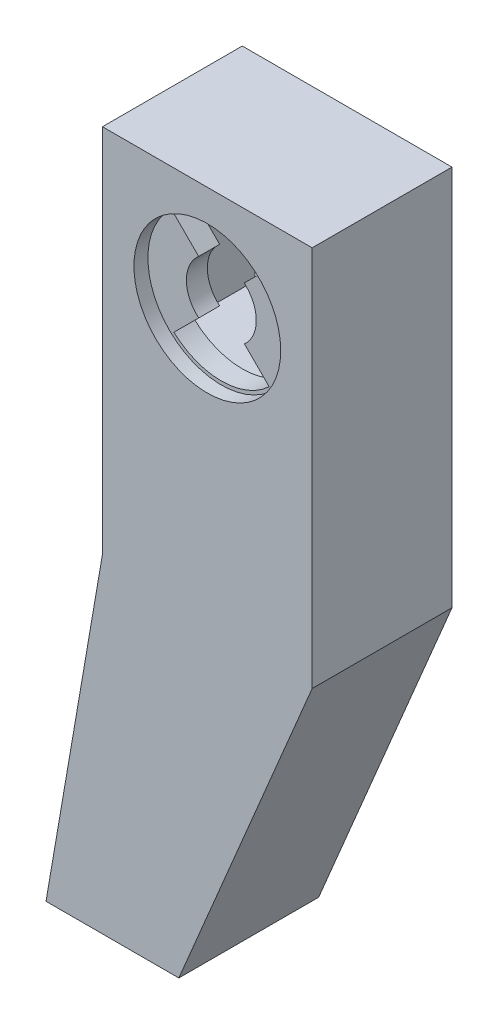
ISO-10303-21;
HEADER;
FILE_DESCRIPTION(('STEP AP214'),'2;1');
FILE_NAME('part.step','',(''),(''),'','','');
FILE_SCHEMA(('AUTOMOTIVE_DESIGN { 1 0 10303 214 1 1 1 1 }'));
ENDSEC;
DATA;
#1=APPLICATION_CONTEXT('core data for automotive mechanical design processes');
#2=APPLICATION_PROTOCOL_DEFINITION('international standard','automotive_design',2000,#1);
#3=PRODUCT_CONTEXT('',#1,'mechanical');
#4=PRODUCT('Part','Part','',(#3));
#5=PRODUCT_RELATED_PRODUCT_CATEGORY('part','',(#4));
#6=PRODUCT_DEFINITION_FORMATION('','',#4);
#7=PRODUCT_DEFINITION_CONTEXT('part definition',#1,'design');
#8=PRODUCT_DEFINITION('design','',#6,#7);
#9=PRODUCT_DEFINITION_SHAPE('','',#8);
#10=(LENGTH_UNIT() NAMED_UNIT(*) SI_UNIT(.MILLI.,.METRE.));
#11=(NAMED_UNIT(*) PLANE_ANGLE_UNIT() SI_UNIT($,.RADIAN.));
#12=(NAMED_UNIT(*) SI_UNIT($,.STERADIAN.) SOLID_ANGLE_UNIT());
#13=UNCERTAINTY_MEASURE_WITH_UNIT(LENGTH_MEASURE(1.E-05),#10,'distance_accuracy_value','');
#14=(GEOMETRIC_REPRESENTATION_CONTEXT(3) GLOBAL_UNCERTAINTY_ASSIGNED_CONTEXT((#13)) GLOBAL_UNIT_ASSIGNED_CONTEXT((#10,
#11,#12)) REPRESENTATION_CONTEXT('',''));
#15=CARTESIAN_POINT('',(0.,0.,0.));
#16=DIRECTION('',(0.,0.,1.));
#17=DIRECTION('',(1.,0.,0.));
#18=AXIS2_PLACEMENT_3D('',#15,#16,#17);
#19=CARTESIAN_POINT('',(-28.6057259152176,11.0797806827455,-5.));
#20=DIRECTION('',(-0.707106781186547,-0.707106781186548,0.));
#21=DIRECTION('',(0.707106781186548,-0.707106781186547,0.));
#22=AXIS2_PLACEMENT_3D('',#19,#20,#21);
#23=PLANE('',#22);
#24=DIRECTION('',(0.,0.,1.));
#25=VECTOR('',#24,1.);
#26=CARTESIAN_POINT('',(-25.066760196614,7.54081496414187,-5.));
#27=LINE('',#26,#25);
#28=CARTESIAN_POINT('',(-25.066760196614,7.54081496414187,-5.));
#29=VERTEX_POINT('',#28);
#30=CARTESIAN_POINT('',(-25.066760196614,7.54081496414187,-2.));
#31=VERTEX_POINT('',#30);
#32=EDGE_CURVE('E253',#29,#31,#27,.T.);
#33=ORIENTED_EDGE('',*,*,#32,.T.);
#34=DIRECTION('',(-0.707106781186548,0.707106781186547,0.));
#35=VECTOR('',#34,1.);
#36=CARTESIAN_POINT('',(-28.6057259152176,11.0797806827455,-2.));
#37=LINE('',#36,#35);
#38=CARTESIAN_POINT('',(-28.6057259152176,11.0797806827455,-2.));
#39=VERTEX_POINT('',#38);
#40=EDGE_CURVE('E243',#31,#39,#37,.T.);
#41=ORIENTED_EDGE('',*,*,#40,.T.);
#42=DIRECTION('',(0.,0.,1.));
#43=VECTOR('',#42,1.);
#44=CARTESIAN_POINT('',(-28.6057259152176,11.0797806827455,-5.));
#45=LINE('',#44,#43);
#46=CARTESIAN_POINT('',(-28.6057259152176,11.0797806827455,-5.));
#47=VERTEX_POINT('',#46);
#48=EDGE_CURVE('E250',#47,#39,#45,.T.);
#49=ORIENTED_EDGE('',*,*,#48,.F.);
#50=DIRECTION('',(0.707106781186548,-0.707106781186547,0.));
#51=VECTOR('',#50,1.);
#52=CARTESIAN_POINT('',(-28.6057259152176,11.0797806827455,-5.));
#53=LINE('',#52,#51);
#54=EDGE_CURVE('E254',#47,#29,#53,.T.);
#55=ORIENTED_EDGE('',*,*,#54,.T.);
#56=EDGE_LOOP('',(#33,#41,#49,#55));
#57=FACE_BOUND('',#56,.T.);
#58=ADVANCED_FACE('F112',(#57),#23,.T.);
#59=CARTESIAN_POINT('',(-31.9142857142857,14.8285714285714,-5.));
#60=DIRECTION('',(0.,0.,1.));
#61=DIRECTION('',(1.,0.,0.));
#62=AXIS2_PLACEMENT_3D('',#59,#60,#61);
#63=CYLINDRICAL_SURFACE('',#62,10.);
#64=CARTESIAN_POINT('',(-31.9142857142857,14.8285714285714,-2.));
#65=DIRECTION('',(0.,0.,1.));
#66=DIRECTION('',(1.,0.,0.));
#67=AXIS2_PLACEMENT_3D('',#64,#65,#66);
#68=CIRCLE('',#67,10.);
#69=CARTESIAN_POINT('',(-38.6930913069154,7.47685089951612,-2.));
#70=VERTEX_POINT('',#69);
#71=EDGE_CURVE('E255',#31,#70,#68,.F.);
#72=ORIENTED_EDGE('',*,*,#71,.F.);
#73=ORIENTED_EDGE('',*,*,#32,.F.);
#74=CARTESIAN_POINT('',(-31.9142857142857,14.8285714285714,-5.));
#75=DIRECTION('',(0.,0.,1.));
#76=DIRECTION('',(1.,0.,0.));
#77=AXIS2_PLACEMENT_3D('',#74,#75,#76);
#78=CIRCLE('',#77,10.);
#79=CARTESIAN_POINT('',(-38.6930913069154,7.47685089951612,-5.));
#80=VERTEX_POINT('',#79);
#81=EDGE_CURVE('E462',#80,#29,#78,.T.);
#82=ORIENTED_EDGE('',*,*,#81,.F.);
#83=DIRECTION('',(0.,0.,1.));
#84=VECTOR('',#83,1.);
#85=CARTESIAN_POINT('',(-38.6930913069154,7.47685089951612,-5.));
#86=LINE('',#85,#84);
#87=EDGE_CURVE('E283',#80,#70,#86,.T.);
#88=ORIENTED_EDGE('',*,*,#87,.T.);
#89=EDGE_LOOP('',(#72,#73,#82,#88));
#90=FACE_BOUND('',#89,.T.);
#91=ADVANCED_FACE('F398',(#90),#63,.F.);
#92=CARTESIAN_POINT('',(-35.1517383071989,11.0182038992326,-5.));
#93=DIRECTION('',(-0.707106781186548,0.707106781186547,0.));
#94=DIRECTION('',(-0.707106781186547,-0.707106781186548,0.));
#95=AXIS2_PLACEMENT_3D('',#92,#93,#94);
#96=PLANE('',#95);
#97=DIRECTION('',(0.707106781186547,0.707106781186548,0.));
#98=VECTOR('',#97,1.);
#99=CARTESIAN_POINT('',(-35.1517383071989,11.0182038992326,-2.));
#100=LINE('',#99,#98);
#101=CARTESIAN_POINT('',(-35.1517383071989,11.0182038992326,-2.));
#102=VERTEX_POINT('',#101);
#103=EDGE_CURVE('E458',#70,#102,#100,.T.);
#104=ORIENTED_EDGE('',*,*,#103,.F.);
#105=ORIENTED_EDGE('',*,*,#87,.F.);
#106=DIRECTION('',(-0.707106781186547,-0.707106781186548,0.));
#107=VECTOR('',#106,1.);
#108=CARTESIAN_POINT('',(-35.1517383071989,11.0182038992326,-5.));
#109=LINE('',#108,#107);
#110=CARTESIAN_POINT('',(-35.1517383071989,11.0182038992326,-5.));
#111=VERTEX_POINT('',#110);
#112=EDGE_CURVE('E465',#111,#80,#109,.T.);
#113=ORIENTED_EDGE('',*,*,#112,.F.);
#114=DIRECTION('',(0.,0.,1.));
#115=VECTOR('',#114,1.);
#116=CARTESIAN_POINT('',(-35.1517383071989,11.0182038992326,-5.));
#117=LINE('',#116,#115);
#118=EDGE_CURVE('E280',#111,#102,#117,.T.);
#119=ORIENTED_EDGE('',*,*,#118,.T.);
#120=EDGE_LOOP('',(#104,#105,#113,#119));
#121=FACE_BOUND('',#120,.T.);
#122=ADVANCED_FACE('F403',(#121),#96,.F.);
#123=CARTESIAN_POINT('',(-31.9142857142857,14.8285714285714,-5.));
#124=DIRECTION('',(0.,0.,1.));
#125=DIRECTION('',(1.,0.,0.));
#126=AXIS2_PLACEMENT_3D('',#123,#124,#125);
#127=CYLINDRICAL_SURFACE('',#126,5.);
#128=CARTESIAN_POINT('',(-31.9142857142857,14.8285714285714,-2.));
#129=DIRECTION('',(0.,0.,1.));
#130=DIRECTION('',(1.,0.,0.));
#131=AXIS2_PLACEMENT_3D('',#128,#129,#130);
#132=CIRCLE('',#131,5.);
#133=CARTESIAN_POINT('',(-35.1517383071989,18.6389389579103,-2.));
#134=VERTEX_POINT('',#133);
#135=EDGE_CURVE('E456',#102,#134,#132,.F.);
#136=ORIENTED_EDGE('',*,*,#135,.F.);
#137=ORIENTED_EDGE('',*,*,#118,.F.);
#138=CARTESIAN_POINT('',(-31.9142857142857,14.8285714285714,-5.));
#139=DIRECTION('',(0.,0.,1.));
#140=DIRECTION('',(1.,0.,0.));
#141=AXIS2_PLACEMENT_3D('',#138,#139,#140);
#142=CIRCLE('',#141,5.);
#143=CARTESIAN_POINT('',(-35.1517383071989,18.6389389579103,-5.));
#144=VERTEX_POINT('',#143);
#145=EDGE_CURVE('E468',#144,#111,#142,.T.);
#146=ORIENTED_EDGE('',*,*,#145,.F.);
#147=DIRECTION('',(0.,0.,1.));
#148=VECTOR('',#147,1.);
#149=CARTESIAN_POINT('',(-35.1517383071989,18.6389389579103,-5.));
#150=LINE('',#149,#148);
#151=EDGE_CURVE('E277',#144,#134,#150,.T.);
#152=ORIENTED_EDGE('',*,*,#151,.T.);
#153=EDGE_LOOP('',(#136,#137,#146,#152));
#154=FACE_BOUND('',#153,.T.);
#155=ADVANCED_FACE('F491',(#154),#127,.F.);
#156=CARTESIAN_POINT('',(-35.1517383071989,18.6389389579103,-5.));
#157=DIRECTION('',(0.707106781186548,0.707106781186547,0.));
#158=DIRECTION('',(-0.707106781186547,0.707106781186548,0.));
#159=AXIS2_PLACEMENT_3D('',#156,#157,#158);
#160=PLANE('',#159);
#161=DIRECTION('',(0.,0.,1.));
#162=VECTOR('',#161,1.);
#163=CARTESIAN_POINT('',(-38.6930913069154,22.1802919576268,-5.));
#164=LINE('',#163,#162);
#165=CARTESIAN_POINT('',(-38.6930913069154,22.1802919576268,-5.));
#166=VERTEX_POINT('',#165);
#167=CARTESIAN_POINT('',(-38.6930913069154,22.1802919576268,-2.));
#168=VERTEX_POINT('',#167);
#169=EDGE_CURVE('E274',#166,#168,#164,.T.);
#170=ORIENTED_EDGE('',*,*,#169,.T.);
#171=DIRECTION('',(0.707106781186547,-0.707106781186548,0.));
#172=VECTOR('',#171,1.);
#173=CARTESIAN_POINT('',(-35.1517383071989,18.6389389579103,-2.));
#174=LINE('',#173,#172);
#175=EDGE_CURVE('E453',#168,#134,#174,.T.);
#176=ORIENTED_EDGE('',*,*,#175,.T.);
#177=ORIENTED_EDGE('',*,*,#151,.F.);
#178=DIRECTION('',(-0.707106781186547,0.707106781186548,0.));
#179=VECTOR('',#178,1.);
#180=CARTESIAN_POINT('',(-35.1517383071989,18.6389389579103,-5.));
#181=LINE('',#180,#179);
#182=EDGE_CURVE('E471',#144,#166,#181,.T.);
#183=ORIENTED_EDGE('',*,*,#182,.T.);
#184=EDGE_LOOP('',(#170,#176,#177,#183));
#185=FACE_BOUND('',#184,.T.);
#186=ADVANCED_FACE('F495',(#185),#160,.T.);
#187=CARTESIAN_POINT('',(-31.9142857142857,14.8285714285714,-5.));
#188=DIRECTION('',(0.,0.,1.));
#189=DIRECTION('',(1.,0.,0.));
#190=AXIS2_PLACEMENT_3D('',#187,#188,#189);
#191=CYLINDRICAL_SURFACE('',#190,10.);
#192=CARTESIAN_POINT('',(-31.9142857142857,14.8285714285714,-2.));
#193=DIRECTION('',(0.,0.,1.));
#194=DIRECTION('',(1.,0.,0.));
#195=AXIS2_PLACEMENT_3D('',#192,#193,#194);
#196=CIRCLE('',#195,10.);
#197=CARTESIAN_POINT('',(-25.0985746011971,22.1460902719308,-2.));
#198=VERTEX_POINT('',#197);
#199=EDGE_CURVE('E451',#168,#198,#196,.F.);
#200=ORIENTED_EDGE('',*,*,#199,.F.);
#201=ORIENTED_EDGE('',*,*,#169,.F.);
#202=CARTESIAN_POINT('',(-31.9142857142857,14.8285714285714,-5.));
#203=DIRECTION('',(0.,0.,1.));
#204=DIRECTION('',(1.,0.,0.));
#205=AXIS2_PLACEMENT_3D('',#202,#203,#204);
#206=CIRCLE('',#205,10.);
#207=CARTESIAN_POINT('',(-25.0985746011971,22.1460902719308,-5.));
#208=VERTEX_POINT('',#207);
#209=EDGE_CURVE('E473',#208,#166,#206,.T.);
#210=ORIENTED_EDGE('',*,*,#209,.F.);
#211=DIRECTION('',(0.,0.,1.));
#212=VECTOR('',#211,1.);
#213=CARTESIAN_POINT('',(-25.0985746011971,22.1460902719308,-5.));
#214=LINE('',#213,#212);
#215=EDGE_CURVE('E271',#208,#198,#214,.T.);
#216=ORIENTED_EDGE('',*,*,#215,.T.);
#217=EDGE_LOOP('',(#200,#201,#210,#216));
#218=FACE_BOUND('',#217,.T.);
#219=ADVANCED_FACE('F499',(#218),#191,.F.);
#220=CARTESIAN_POINT('',(-28.6057259152176,18.6389389579103,-5.));
#221=DIRECTION('',(0.707106781186547,-0.707106781186548,0.));
#222=DIRECTION('',(0.707106781186548,0.707106781186547,0.));
#223=AXIS2_PLACEMENT_3D('',#220,#221,#222);
#224=PLANE('',#223);
#225=DIRECTION('',(-0.707106781186548,-0.707106781186547,0.));
#226=VECTOR('',#225,1.);
#227=CARTESIAN_POINT('',(-28.6057259152176,18.6389389579103,-2.));
#228=LINE('',#227,#226);
#229=CARTESIAN_POINT('',(-28.6057259152176,18.6389389579103,-2.));
#230=VERTEX_POINT('',#229);
#231=EDGE_CURVE('E449',#198,#230,#228,.T.);
#232=ORIENTED_EDGE('',*,*,#231,.F.);
#233=ORIENTED_EDGE('',*,*,#215,.F.);
#234=DIRECTION('',(0.707106781186548,0.707106781186547,0.));
#235=VECTOR('',#234,1.);
#236=CARTESIAN_POINT('',(-28.6057259152176,18.6389389579103,-5.));
#237=LINE('',#236,#235);
#238=CARTESIAN_POINT('',(-28.6057259152176,18.6389389579103,-5.));
#239=VERTEX_POINT('',#238);
#240=EDGE_CURVE('E476',#239,#208,#237,.T.);
#241=ORIENTED_EDGE('',*,*,#240,.F.);
#242=DIRECTION('',(0.,0.,1.));
#243=VECTOR('',#242,1.);
#244=CARTESIAN_POINT('',(-28.6057259152176,18.6389389579103,-5.));
#245=LINE('',#244,#243);
#246=EDGE_CURVE('E263',#239,#230,#245,.T.);
#247=ORIENTED_EDGE('',*,*,#246,.T.);
#248=EDGE_LOOP('',(#232,#233,#241,#247));
#249=FACE_BOUND('',#248,.T.);
#250=ADVANCED_FACE('F502',(#249),#224,.F.);
#251=CARTESIAN_POINT('',(-28.6057259152176,18.6389389579103,-5.));
#252=DIRECTION('',(-0.771047654122615,-0.636777445479982,0.));
#253=DIRECTION('',(0.636777445479982,-0.771047654122615,0.));
#254=AXIS2_PLACEMENT_3D('',#251,#252,#253);
#255=PLANE('',#254);
#256=DIRECTION('',(0.,0.,1.));
#257=VECTOR('',#256,1.);
#258=CARTESIAN_POINT('',(-28.378751808353,18.3641053345042,-5.));
#259=LINE('',#258,#257);
#260=CARTESIAN_POINT('',(-28.378751808353,18.3641053345042,-5.));
#261=VERTEX_POINT('',#260);
#262=CARTESIAN_POINT('',(-28.378751808353,18.3641053345042,-2.));
#263=VERTEX_POINT('',#262);
#264=EDGE_CURVE('E261',#261,#263,#259,.T.);
#265=ORIENTED_EDGE('',*,*,#264,.T.);
#266=DIRECTION('',(-0.636777445479982,0.771047654122615,0.));
#267=VECTOR('',#266,1.);
#268=CARTESIAN_POINT('',(-28.6057259152176,18.6389389579103,-2.));
#269=LINE('',#268,#267);
#270=EDGE_CURVE('E126',#263,#230,#269,.T.);
#271=ORIENTED_EDGE('',*,*,#270,.T.);
#272=ORIENTED_EDGE('',*,*,#246,.F.);
#273=DIRECTION('',(0.636777445479982,-0.771047654122615,0.));
#274=VECTOR('',#273,1.);
#275=CARTESIAN_POINT('',(-28.6057259152176,18.6389389579103,-5.));
#276=LINE('',#275,#274);
#277=EDGE_CURVE('E265',#239,#261,#276,.T.);
#278=ORIENTED_EDGE('',*,*,#277,.T.);
#279=EDGE_LOOP('',(#265,#271,#272,#278));
#280=FACE_BOUND('',#279,.T.);
#281=ADVANCED_FACE('F481',(#280),#255,.T.);
#282=CARTESIAN_POINT('',(-31.9142857142857,14.8285714285714,-5.));
#283=DIRECTION('',(0.,0.,1.));
#284=DIRECTION('',(1.,0.,0.));
#285=AXIS2_PLACEMENT_3D('',#282,#283,#284);
#286=CYLINDRICAL_SURFACE('',#285,5.);
#287=CARTESIAN_POINT('',(-31.9142857142857,14.8285714285714,-2.));
#288=DIRECTION('',(0.,0.,1.));
#289=DIRECTION('',(1.,0.,0.));
#290=AXIS2_PLACEMENT_3D('',#287,#288,#289);
#291=CIRCLE('',#290,5.);
#292=EDGE_CURVE('E12',#263,#39,#291,.F.);
#293=ORIENTED_EDGE('',*,*,#292,.F.);
#294=ORIENTED_EDGE('',*,*,#264,.F.);
#295=CARTESIAN_POINT('',(-31.9142857142857,14.8285714285714,-5.));
#296=DIRECTION('',(0.,0.,1.));
#297=DIRECTION('',(1.,0.,0.));
#298=AXIS2_PLACEMENT_3D('',#295,#296,#297);
#299=CIRCLE('',#298,5.);
#300=EDGE_CURVE('E259',#47,#261,#299,.T.);
#301=ORIENTED_EDGE('',*,*,#300,.F.);
#302=ORIENTED_EDGE('',*,*,#48,.T.);
#303=EDGE_LOOP('',(#293,#294,#301,#302));
#304=FACE_BOUND('',#303,.T.);
#305=ADVANCED_FACE('F257',(#304),#286,.F.);
#306=CARTESIAN_POINT('',(-45.1142857142857,28.0285714285714,-20.));
#307=DIRECTION('',(-1.,0.,0.));
#308=DIRECTION('',(0.,0.,1.));
#309=AXIS2_PLACEMENT_3D('',#306,#307,#308);
#310=PLANE('',#309);
#311=DIRECTION('',(0.,-1.,0.));
#312=VECTOR('',#311,1.);
#313=CARTESIAN_POINT('',(-45.1142857142857,28.0285714285714,-5.));
#314=LINE('',#313,#312);
#315=CARTESIAN_POINT('',(-45.1142857142857,28.0285714285714,-5.));
#316=VERTEX_POINT('',#315);
#317=CARTESIAN_POINT('',(-45.1142857142857,1.62857142857145,-5.));
#318=VERTEX_POINT('',#317);
#319=EDGE_CURVE('E287',#316,#318,#314,.T.);
#320=ORIENTED_EDGE('',*,*,#319,.T.);
#321=DIRECTION('',(0.,0.,1.));
#322=VECTOR('',#321,1.);
#323=CARTESIAN_POINT('',(-45.1142857142857,1.62857142857145,-20.));
#324=LINE('',#323,#322);
#325=CARTESIAN_POINT('',(-45.1142857142857,1.62857142857145,-20.));
#326=VERTEX_POINT('',#325);
#327=EDGE_CURVE('E307',#326,#318,#324,.T.);
#328=ORIENTED_EDGE('',*,*,#327,.F.);
#329=DIRECTION('',(0.,-1.,0.));
#330=VECTOR('',#329,1.);
#331=CARTESIAN_POINT('',(-45.1142857142857,28.0285714285714,-20.));
#332=LINE('',#331,#330);
#333=CARTESIAN_POINT('',(-45.1142857142857,28.0285714285714,-20.));
#334=VERTEX_POINT('',#333);
#335=EDGE_CURVE('E296',#334,#326,#332,.T.);
#336=ORIENTED_EDGE('',*,*,#335,.F.);
#337=DIRECTION('',(0.,0.,1.));
#338=VECTOR('',#337,1.);
#339=CARTESIAN_POINT('',(-45.1142857142857,28.0285714285714,-20.));
#340=LINE('',#339,#338);
#341=EDGE_CURVE('E308',#334,#316,#340,.T.);
#342=ORIENTED_EDGE('',*,*,#341,.T.);
#343=EDGE_LOOP('',(#320,#328,#336,#342));
#344=FACE_BOUND('',#343,.T.);
#345=ADVANCED_FACE('F417',(#344),#310,.F.);
#346=CARTESIAN_POINT('',(-45.1142857142857,28.0285714285714,-20.));
#347=DIRECTION('',(0.,-1.,0.));
#348=DIRECTION('',(0.,0.,-1.));
#349=AXIS2_PLACEMENT_3D('',#346,#347,#348);
#350=PLANE('',#349);
#351=DIRECTION('',(0.,0.,1.));
#352=VECTOR('',#351,1.);
#353=CARTESIAN_POINT('',(-18.7142857142857,28.0285714285714,-20.));
#354=LINE('',#353,#352);
#355=CARTESIAN_POINT('',(-18.7142857142857,28.0285714285714,-20.));
#356=VERTEX_POINT('',#355);
#357=CARTESIAN_POINT('',(-18.7142857142857,28.0285714285714,-5.));
#358=VERTEX_POINT('',#357);
#359=EDGE_CURVE('E311',#356,#358,#354,.T.);
#360=ORIENTED_EDGE('',*,*,#359,.T.);
#361=DIRECTION('',(1.,0.,0.));
#362=VECTOR('',#361,1.);
#363=CARTESIAN_POINT('',(-45.1142857142857,28.0285714285714,-5.));
#364=LINE('',#363,#362);
#365=EDGE_CURVE('E134',#316,#358,#364,.T.);
#366=ORIENTED_EDGE('',*,*,#365,.F.);
#367=ORIENTED_EDGE('',*,*,#341,.F.);
#368=DIRECTION('',(1.,0.,0.));
#369=VECTOR('',#368,1.);
#370=CARTESIAN_POINT('',(-45.1142857142857,28.0285714285714,-20.));
#371=LINE('',#370,#369);
#372=EDGE_CURVE('E305',#334,#356,#371,.T.);
#373=ORIENTED_EDGE('',*,*,#372,.T.);
#374=EDGE_LOOP('',(#360,#366,#367,#373));
#375=FACE_BOUND('',#374,.T.);
#376=ADVANCED_FACE('F413',(#375),#350,.T.);
#377=CARTESIAN_POINT('',(-18.7142857142857,28.0285714285714,-20.));
#378=DIRECTION('',(-1.,0.,0.));
#379=DIRECTION('',(0.,0.,1.));
#380=AXIS2_PLACEMENT_3D('',#377,#378,#379);
#381=PLANE('',#380);
#382=DIRECTION('',(0.,0.,1.));
#383=VECTOR('',#382,1.);
#384=CARTESIAN_POINT('',(-18.7142857142857,1.62857142857145,-20.));
#385=LINE('',#384,#383);
#386=CARTESIAN_POINT('',(-18.7142857142857,1.62857142857145,-20.));
#387=VERTEX_POINT('',#386);
#388=CARTESIAN_POINT('',(-18.7142857142857,1.62857142857145,-5.));
#389=VERTEX_POINT('',#388);
#390=EDGE_CURVE('E313',#387,#389,#385,.T.);
#391=ORIENTED_EDGE('',*,*,#390,.T.);
#392=DIRECTION('',(0.,-1.,0.));
#393=VECTOR('',#392,1.);
#394=CARTESIAN_POINT('',(-18.7142857142857,28.0285714285714,-5.));
#395=LINE('',#394,#393);
#396=EDGE_CURVE('E292',#358,#389,#395,.T.);
#397=ORIENTED_EDGE('',*,*,#396,.F.);
#398=ORIENTED_EDGE('',*,*,#359,.F.);
#399=DIRECTION('',(0.,-1.,0.));
#400=VECTOR('',#399,1.);
#401=CARTESIAN_POINT('',(-18.7142857142857,28.0285714285714,-20.));
#402=LINE('',#401,#400);
#403=EDGE_CURVE('E302',#356,#387,#402,.T.);
#404=ORIENTED_EDGE('',*,*,#403,.T.);
#405=EDGE_LOOP('',(#391,#397,#398,#404));
#406=FACE_BOUND('',#405,.T.);
#407=ADVANCED_FACE('F416',(#406),#381,.T.);
#408=CARTESIAN_POINT('',(-45.1142857142857,1.62857142857145,-20.));
#409=DIRECTION('',(0.,-1.,0.));
#410=DIRECTION('',(0.,0.,-1.));
#411=AXIS2_PLACEMENT_3D('',#408,#409,#410);
#412=PLANE('',#411);
#413=DIRECTION('',(1.,0.,0.));
#414=VECTOR('',#413,1.);
#415=CARTESIAN_POINT('',(-45.1142857142857,1.62857142857145,-5.));
#416=LINE('',#415,#414);
#417=EDGE_CURVE('E290',#318,#389,#416,.T.);
#418=ORIENTED_EDGE('',*,*,#417,.T.);
#419=ORIENTED_EDGE('',*,*,#390,.F.);
#420=DIRECTION('',(1.,0.,0.));
#421=VECTOR('',#420,1.);
#422=CARTESIAN_POINT('',(-45.1142857142857,1.62857142857145,-20.));
#423=LINE('',#422,#421);
#424=EDGE_CURVE('E299',#326,#387,#423,.T.);
#425=ORIENTED_EDGE('',*,*,#424,.F.);
#426=ORIENTED_EDGE('',*,*,#327,.T.);
#427=EDGE_LOOP('',(#418,#419,#425,#426));
#428=FACE_BOUND('',#427,.T.);
#429=ADVANCED_FACE('F395',(#428),#412,.F.);
#430=CARTESIAN_POINT('',(-16.9142857142857,29.8285714285714,-20.));
#431=DIRECTION('',(0.,1.,0.));
#432=DIRECTION('',(-1.,0.,0.));
#433=AXIS2_PLACEMENT_3D('',#430,#431,#432);
#434=PLANE('',#433);
#435=DIRECTION('',(-1.,0.,0.));
#436=VECTOR('',#435,1.);
#437=CARTESIAN_POINT('',(-16.9142857142857,29.8285714285714,0.));
#438=LINE('',#437,#436);
#439=CARTESIAN_POINT('',(-16.9142857142857,29.8285714285714,0.));
#440=VERTEX_POINT('',#439);
#441=CARTESIAN_POINT('',(-46.9142857142857,29.8285714285714,0.));
#442=VERTEX_POINT('',#441);
#443=EDGE_CURVE('E320',#440,#442,#438,.T.);
#444=ORIENTED_EDGE('',*,*,#443,.F.);
#445=DIRECTION('',(0.,0.,1.));
#446=VECTOR('',#445,1.);
#447=CARTESIAN_POINT('',(-16.9142857142857,29.8285714285714,-20.));
#448=LINE('',#447,#446);
#449=CARTESIAN_POINT('',(-16.9142857142857,29.8285714285714,-20.));
#450=VERTEX_POINT('',#449);
#451=EDGE_CURVE('E349',#450,#440,#448,.T.);
#452=ORIENTED_EDGE('',*,*,#451,.F.);
#453=DIRECTION('',(-1.,0.,0.));
#454=VECTOR('',#453,1.);
#455=CARTESIAN_POINT('',(-16.9142857142857,29.8285714285714,-20.));
#456=LINE('',#455,#454);
#457=CARTESIAN_POINT('',(-46.9142857142857,29.8285714285714,-20.));
#458=VERTEX_POINT('',#457);
#459=EDGE_CURVE('E329',#450,#458,#456,.T.);
#460=ORIENTED_EDGE('',*,*,#459,.T.);
#461=DIRECTION('',(0.,0.,1.));
#462=VECTOR('',#461,1.);
#463=CARTESIAN_POINT('',(-46.9142857142857,29.8285714285714,-20.));
#464=LINE('',#463,#462);
#465=EDGE_CURVE('E120',#458,#442,#464,.T.);
#466=ORIENTED_EDGE('',*,*,#465,.T.);
#467=EDGE_LOOP('',(#444,#452,#460,#466));
#468=FACE_BOUND('',#467,.T.);
#469=ADVANCED_FACE('F374',(#468),#434,.T.);
#470=CARTESIAN_POINT('',(-16.9142857142857,-1.88754150191936,-20.));
#471=DIRECTION('',(1.,0.,0.));
#472=DIRECTION('',(0.,1.,0.));
#473=AXIS2_PLACEMENT_3D('',#470,#471,#472);
#474=PLANE('',#473);
#475=DIRECTION('',(0.,1.,0.));
#476=VECTOR('',#475,1.);
#477=CARTESIAN_POINT('',(-16.9142857142857,-1.88754150191936,0.));
#478=LINE('',#477,#476);
#479=CARTESIAN_POINT('',(-16.9142857142857,-24.7700697279648,0.));
#480=VERTEX_POINT('',#479);
#481=EDGE_CURVE('E342',#480,#440,#478,.T.);
#482=ORIENTED_EDGE('',*,*,#481,.F.);
#483=DIRECTION('',(0.,0.,1.));
#484=VECTOR('',#483,1.);
#485=CARTESIAN_POINT('',(-16.9142857142857,-24.7700697279648,-20.));
#486=LINE('',#485,#484);
#487=CARTESIAN_POINT('',(-16.9142857142857,-24.7700697279648,-20.));
#488=VERTEX_POINT('',#487);
#489=EDGE_CURVE('E351',#488,#480,#486,.T.);
#490=ORIENTED_EDGE('',*,*,#489,.F.);
#491=DIRECTION('',(0.,-1.,0.));
#492=VECTOR('',#491,1.);
#493=CARTESIAN_POINT('',(-16.9142857142857,-1.88754150191936,-20.));
#494=LINE('',#493,#492);
#495=EDGE_CURVE('E327',#450,#488,#494,.T.);
#496=ORIENTED_EDGE('',*,*,#495,.F.);
#497=ORIENTED_EDGE('',*,*,#451,.T.);
#498=EDGE_LOOP('',(#482,#490,#496,#497));
#499=FACE_BOUND('',#498,.T.);
#500=ADVANCED_FACE('F387',(#499),#474,.T.);
#501=CARTESIAN_POINT('',(-16.9142857142857,-24.7700697279648,-20.));
#502=DIRECTION('',(-0.921924389996436,0.387369873802416,0.));
#503=DIRECTION('',(-0.387369873802416,-0.921924389996436,0.));
#504=AXIS2_PLACEMENT_3D('',#501,#502,#503);
#505=PLANE('',#504);
#506=DIRECTION('',(-0.387369873802416,-0.921924389996436,0.));
#507=VECTOR('',#506,1.);
#508=CARTESIAN_POINT('',(-16.9142857142857,-24.7700697279648,0.));
#509=LINE('',#508,#507);
#510=CARTESIAN_POINT('',(-35.9908161071076,-70.1714285714286,0.));
#511=VERTEX_POINT('',#510);
#512=EDGE_CURVE('E340',#480,#511,#509,.T.);
#513=ORIENTED_EDGE('',*,*,#512,.T.);
#514=DIRECTION('',(0.,0.,1.));
#515=VECTOR('',#514,1.);
#516=CARTESIAN_POINT('',(-35.9908161071076,-70.1714285714286,-20.));
#517=LINE('',#516,#515);
#518=CARTESIAN_POINT('',(-35.9908161071076,-70.1714285714286,-20.));
#519=VERTEX_POINT('',#518);
#520=EDGE_CURVE('E354',#519,#511,#517,.T.);
#521=ORIENTED_EDGE('',*,*,#520,.F.);
#522=DIRECTION('',(-0.387369873802416,-0.921924389996436,0.));
#523=VECTOR('',#522,1.);
#524=CARTESIAN_POINT('',(-16.9142857142857,-24.7700697279648,-20.));
#525=LINE('',#524,#523);
#526=EDGE_CURVE('E325',#488,#519,#525,.T.);
#527=ORIENTED_EDGE('',*,*,#526,.F.);
#528=ORIENTED_EDGE('',*,*,#489,.T.);
#529=EDGE_LOOP('',(#513,#521,#527,#528));
#530=FACE_BOUND('',#529,.T.);
#531=ADVANCED_FACE('F384',(#530),#505,.F.);
#532=CARTESIAN_POINT('',(-35.9908161071076,-70.1714285714286,-20.));
#533=DIRECTION('',(0.,1.,0.));
#534=DIRECTION('',(0.,0.,1.));
#535=AXIS2_PLACEMENT_3D('',#532,#533,#534);
#536=PLANE('',#535);
#537=CARTESIAN_POINT('',(-40.9908161071076,-70.1714285714286,-12.));
#538=DIRECTION('',(0.,-1.,0.));
#539=DIRECTION('',(0.,0.,-1.));
#540=AXIS2_PLACEMENT_3D('',#537,#538,#539);
#541=CIRCLE('',#540,1.4);
#542=CARTESIAN_POINT('',(-40.9908161071076,-70.1714285714286,-13.4));
#543=VERTEX_POINT('',#542);
#544=EDGE_CURVE('E444',#543,#543,#541,.T.);
#545=ORIENTED_EDGE('',*,*,#544,.F.);
#546=EDGE_LOOP('',(#545));
#547=FACE_BOUND('',#546,.T.);
#548=CARTESIAN_POINT('',(-49.9908161071076,-70.1714285714286,-12.));
#549=DIRECTION('',(0.,-1.,0.));
#550=DIRECTION('',(0.,0.,-1.));
#551=AXIS2_PLACEMENT_3D('',#548,#549,#550);
#552=CIRCLE('',#551,1.4);
#553=CARTESIAN_POINT('',(-49.9908161071076,-70.1714285714286,-13.4));
#554=VERTEX_POINT('',#553);
#555=EDGE_CURVE('E773',#554,#554,#552,.T.);
#556=ORIENTED_EDGE('',*,*,#555,.F.);
#557=EDGE_LOOP('',(#556));
#558=FACE_BOUND('',#557,.T.);
#559=DIRECTION('',(-1.,0.,0.));
#560=VECTOR('',#559,1.);
#561=CARTESIAN_POINT('',(-35.9908161071076,-70.1714285714286,0.));
#562=LINE('',#561,#560);
#563=CARTESIAN_POINT('',(-54.9908161071076,-70.1714285714286,0.));
#564=VERTEX_POINT('',#563);
#565=EDGE_CURVE('E338',#511,#564,#562,.T.);
#566=ORIENTED_EDGE('',*,*,#565,.T.);
#567=DIRECTION('',(0.,0.,1.));
#568=VECTOR('',#567,1.);
#569=CARTESIAN_POINT('',(-54.9908161071076,-70.1714285714286,-20.));
#570=LINE('',#569,#568);
#571=CARTESIAN_POINT('',(-54.9908161071076,-70.1714285714286,-20.));
#572=VERTEX_POINT('',#571);
#573=EDGE_CURVE('E357',#572,#564,#570,.T.);
#574=ORIENTED_EDGE('',*,*,#573,.F.);
#575=DIRECTION('',(-1.,0.,0.));
#576=VECTOR('',#575,1.);
#577=CARTESIAN_POINT('',(-35.9908161071076,-70.1714285714286,-20.));
#578=LINE('',#577,#576);
#579=EDGE_CURVE('E323',#519,#572,#578,.T.);
#580=ORIENTED_EDGE('',*,*,#579,.F.);
#581=ORIENTED_EDGE('',*,*,#520,.T.);
#582=EDGE_LOOP('',(#566,#574,#580,#581));
#583=FACE_BOUND('',#582,.T.);
#584=ADVANCED_FACE('F382',(#547,#558,#583),#536,.F.);
#585=CARTESIAN_POINT('',(-54.9908161071076,-70.1714285714286,-20.));
#586=DIRECTION('',(0.985578249014438,-0.169220315180045,0.));
#587=DIRECTION('',(0.169220315180045,0.985578249014438,0.));
#588=AXIS2_PLACEMENT_3D('',#585,#586,#587);
#589=PLANE('',#588);
#590=DIRECTION('',(0.169220315180045,0.985578249014438,0.));
#591=VECTOR('',#590,1.);
#592=CARTESIAN_POINT('',(-54.9908161071076,-70.1714285714286,0.));
#593=LINE('',#592,#591);
#594=CARTESIAN_POINT('',(-46.9142857142857,-23.1318478083269,0.));
#595=VERTEX_POINT('',#594);
#596=EDGE_CURVE('E335',#564,#595,#593,.T.);
#597=ORIENTED_EDGE('',*,*,#596,.T.);
#598=DIRECTION('',(0.,0.,1.));
#599=VECTOR('',#598,1.);
#600=CARTESIAN_POINT('',(-46.9142857142857,-23.1318478083269,-20.));
#601=LINE('',#600,#599);
#602=CARTESIAN_POINT('',(-46.9142857142857,-23.1318478083269,-20.));
#603=VERTEX_POINT('',#602);
#604=EDGE_CURVE('E332',#603,#595,#601,.T.);
#605=ORIENTED_EDGE('',*,*,#604,.F.);
#606=DIRECTION('',(0.169220315180045,0.985578249014438,0.));
#607=VECTOR('',#606,1.);
#608=CARTESIAN_POINT('',(-54.9908161071076,-70.1714285714286,-20.));
#609=LINE('',#608,#607);
#610=EDGE_CURVE('E319',#572,#603,#609,.T.);
#611=ORIENTED_EDGE('',*,*,#610,.F.);
#612=ORIENTED_EDGE('',*,*,#573,.T.);
#613=EDGE_LOOP('',(#597,#605,#611,#612));
#614=FACE_BOUND('',#613,.T.);
#615=ADVANCED_FACE('F365',(#614),#589,.F.);
#616=CARTESIAN_POINT('',(-46.9142857142857,-1.88754150191938,-20.));
#617=DIRECTION('',(-1.,0.,0.));
#618=DIRECTION('',(0.,-1.,0.));
#619=AXIS2_PLACEMENT_3D('',#616,#617,#618);
#620=PLANE('',#619);
#621=DIRECTION('',(0.,-1.,0.));
#622=VECTOR('',#621,1.);
#623=CARTESIAN_POINT('',(-46.9142857142857,-1.88754150191938,0.));
#624=LINE('',#623,#622);
#625=EDGE_CURVE('E310',#442,#595,#624,.T.);
#626=ORIENTED_EDGE('',*,*,#625,.F.);
#627=ORIENTED_EDGE('',*,*,#465,.F.);
#628=DIRECTION('',(0.,-1.,0.));
#629=VECTOR('',#628,1.);
#630=CARTESIAN_POINT('',(-46.9142857142857,29.8285714285714,-20.));
#631=LINE('',#630,#629);
#632=EDGE_CURVE('E317',#458,#603,#631,.T.);
#633=ORIENTED_EDGE('',*,*,#632,.T.);
#634=ORIENTED_EDGE('',*,*,#604,.T.);
#635=EDGE_LOOP('',(#626,#627,#633,#634));
#636=FACE_BOUND('',#635,.T.);
#637=ADVANCED_FACE('F114',(#636),#620,.T.);
#638=CARTESIAN_POINT('',(0.,0.,-20.));
#639=DIRECTION('',(0.,0.,-1.));
#640=DIRECTION('',(-1.,0.,0.));
#641=AXIS2_PLACEMENT_3D('',#638,#639,#640);
#642=PLANE('',#641);
#643=ORIENTED_EDGE('',*,*,#335,.T.);
#644=ORIENTED_EDGE('',*,*,#424,.T.);
#645=ORIENTED_EDGE('',*,*,#403,.F.);
#646=ORIENTED_EDGE('',*,*,#372,.F.);
#647=EDGE_LOOP('',(#643,#644,#645,#646));
#648=FACE_BOUND('',#647,.T.);
#649=ORIENTED_EDGE('',*,*,#632,.F.);
#650=ORIENTED_EDGE('',*,*,#459,.F.);
#651=ORIENTED_EDGE('',*,*,#495,.T.);
#652=ORIENTED_EDGE('',*,*,#526,.T.);
#653=ORIENTED_EDGE('',*,*,#579,.T.);
#654=ORIENTED_EDGE('',*,*,#610,.T.);
#655=EDGE_LOOP('',(#649,#650,#651,#652,#653,#654));
#656=FACE_BOUND('',#655,.T.);
#657=ADVANCED_FACE('F377',(#648,#656),#642,.T.);
#658=CARTESIAN_POINT('',(0.,0.,0.));
#659=DIRECTION('',(0.,0.,-1.));
#660=DIRECTION('',(-1.,0.,0.));
#661=AXIS2_PLACEMENT_3D('',#658,#659,#660);
#662=PLANE('',#661);
#663=CARTESIAN_POINT('',(-31.9142857142857,14.8285714285714,0.));
#664=DIRECTION('',(0.,0.,1.));
#665=DIRECTION('',(1.,0.,0.));
#666=AXIS2_PLACEMENT_3D('',#663,#664,#665);
#667=CIRCLE('',#666,10.5);
#668=CARTESIAN_POINT('',(-21.4142857142857,14.8285714285714,0.));
#669=VERTEX_POINT('',#668);
#670=EDGE_CURVE('E436',#669,#669,#667,.T.);
#671=ORIENTED_EDGE('',*,*,#670,.F.);
#672=EDGE_LOOP('',(#671));
#673=FACE_BOUND('',#672,.T.);
#674=ORIENTED_EDGE('',*,*,#443,.T.);
#675=ORIENTED_EDGE('',*,*,#625,.T.);
#676=ORIENTED_EDGE('',*,*,#596,.F.);
#677=ORIENTED_EDGE('',*,*,#565,.F.);
#678=ORIENTED_EDGE('',*,*,#512,.F.);
#679=ORIENTED_EDGE('',*,*,#481,.T.);
#680=EDGE_LOOP('',(#674,#675,#676,#677,#678,#679));
#681=FACE_BOUND('',#680,.T.);
#682=ADVANCED_FACE('F369',(#673,#681),#662,.F.);
#683=CARTESIAN_POINT('',(0.,0.,-5.));
#684=DIRECTION('',(0.,0.,1.));
#685=DIRECTION('',(1.,0.,0.));
#686=AXIS2_PLACEMENT_3D('',#683,#684,#685);
#687=PLANE('',#686);
#688=ORIENTED_EDGE('',*,*,#319,.F.);
#689=ORIENTED_EDGE('',*,*,#365,.T.);
#690=ORIENTED_EDGE('',*,*,#396,.T.);
#691=ORIENTED_EDGE('',*,*,#417,.F.);
#692=EDGE_LOOP('',(#688,#689,#690,#691));
#693=FACE_BOUND('',#692,.T.);
#694=ORIENTED_EDGE('',*,*,#54,.F.);
#695=ORIENTED_EDGE('',*,*,#300,.T.);
#696=ORIENTED_EDGE('',*,*,#277,.F.);
#697=ORIENTED_EDGE('',*,*,#240,.T.);
#698=ORIENTED_EDGE('',*,*,#209,.T.);
#699=ORIENTED_EDGE('',*,*,#182,.F.);
#700=ORIENTED_EDGE('',*,*,#145,.T.);
#701=ORIENTED_EDGE('',*,*,#112,.T.);
#702=ORIENTED_EDGE('',*,*,#81,.T.);
#703=EDGE_LOOP('',(#694,#695,#696,#697,#698,#699,#700,#701,#702));
#704=FACE_BOUND('',#703,.T.);
#705=ADVANCED_FACE('F408',(#693,#704),#687,.F.);
#706=CARTESIAN_POINT('',(-31.9142857142857,14.8285714285714,-2.));
#707=DIRECTION('',(0.,0.,1.));
#708=DIRECTION('',(1.,0.,0.));
#709=AXIS2_PLACEMENT_3D('',#706,#707,#708);
#710=CYLINDRICAL_SURFACE('',#709,10.5);
#711=CARTESIAN_POINT('',(-31.9142857142857,14.8285714285714,-2.));
#712=DIRECTION('',(0.,0.,1.));
#713=DIRECTION('',(1.,0.,0.));
#714=AXIS2_PLACEMENT_3D('',#711,#712,#713);
#715=CIRCLE('',#714,10.5);
#716=CARTESIAN_POINT('',(-21.4142857142857,14.8285714285714,-2.));
#717=VERTEX_POINT('',#716);
#718=EDGE_CURVE('E438',#717,#717,#715,.T.);
#719=ORIENTED_EDGE('',*,*,#718,.F.);
#720=EDGE_LOOP('',(#719));
#721=FACE_BOUND('',#720,.T.);
#722=ORIENTED_EDGE('',*,*,#670,.T.);
#723=EDGE_LOOP('',(#722));
#724=FACE_BOUND('',#723,.T.);
#725=ADVANCED_FACE('F411',(#721,#724),#710,.F.);
#726=CARTESIAN_POINT('',(-31.9142857142857,14.8285714285714,-2.));
#727=DIRECTION('',(0.,0.,1.));
#728=DIRECTION('',(1.,0.,0.));
#729=AXIS2_PLACEMENT_3D('',#726,#727,#728);
#730=PLANE('',#729);
#731=ORIENTED_EDGE('',*,*,#71,.T.);
#732=ORIENTED_EDGE('',*,*,#103,.T.);
#733=ORIENTED_EDGE('',*,*,#135,.T.);
#734=ORIENTED_EDGE('',*,*,#175,.F.);
#735=ORIENTED_EDGE('',*,*,#199,.T.);
#736=ORIENTED_EDGE('',*,*,#231,.T.);
#737=ORIENTED_EDGE('',*,*,#270,.F.);
#738=ORIENTED_EDGE('',*,*,#292,.T.);
#739=ORIENTED_EDGE('',*,*,#40,.F.);
#740=EDGE_LOOP('',(#731,#732,#733,#734,#735,#736,#737,#738,#739));
#741=FACE_BOUND('',#740,.T.);
#742=ORIENTED_EDGE('',*,*,#718,.T.);
#743=EDGE_LOOP('',(#742));
#744=FACE_BOUND('',#743,.T.);
#745=ADVANCED_FACE('F241',(#741,#744),#730,.T.);
#746=CARTESIAN_POINT('',(-49.9908161071076,-55.1714285714286,-12.));
#747=DIRECTION('',(0.,-1.,0.));
#748=DIRECTION('',(0.,0.,-1.));
#749=AXIS2_PLACEMENT_3D('',#746,#747,#748);
#750=CYLINDRICAL_SURFACE('',#749,1.4);
#751=CARTESIAN_POINT('',(-49.9908161071076,-55.1714285714286,-12.));
#752=DIRECTION('',(0.,-1.,0.));
#753=DIRECTION('',(0.,0.,-1.));
#754=AXIS2_PLACEMENT_3D('',#751,#752,#753);
#755=CIRCLE('',#754,1.4);
#756=CARTESIAN_POINT('',(-49.9908161071076,-55.1714285714286,-13.4));
#757=VERTEX_POINT('',#756);
#758=EDGE_CURVE('E776',#757,#757,#755,.T.);
#759=ORIENTED_EDGE('',*,*,#758,.F.);
#760=EDGE_LOOP('',(#759));
#761=FACE_BOUND('',#760,.T.);
#762=ORIENTED_EDGE('',*,*,#555,.T.);
#763=EDGE_LOOP('',(#762));
#764=FACE_BOUND('',#763,.T.);
#765=ADVANCED_FACE('F578',(#761,#764),#750,.F.);
#766=CARTESIAN_POINT('',(-49.9908161071076,-55.1714285714286,-12.));
#767=DIRECTION('',(0.,-1.,0.));
#768=DIRECTION('',(0.,0.,-1.));
#769=AXIS2_PLACEMENT_3D('',#766,#767,#768);
#770=PLANE('',#769);
#771=ORIENTED_EDGE('',*,*,#758,.T.);
#772=EDGE_LOOP('',(#771));
#773=FACE_BOUND('',#772,.T.);
#774=ADVANCED_FACE('F601',(#773),#770,.T.);
#775=CARTESIAN_POINT('',(-40.9908161071076,-55.1714285714286,-12.));
#776=DIRECTION('',(0.,-1.,0.));
#777=DIRECTION('',(0.,0.,-1.));
#778=AXIS2_PLACEMENT_3D('',#775,#776,#777);
#779=CYLINDRICAL_SURFACE('',#778,1.4);
#780=CARTESIAN_POINT('',(-40.9908161071076,-55.1714285714286,-12.));
#781=DIRECTION('',(0.,-1.,0.));
#782=DIRECTION('',(0.,0.,-1.));
#783=AXIS2_PLACEMENT_3D('',#780,#781,#782);
#784=CIRCLE('',#783,1.4);
#785=CARTESIAN_POINT('',(-40.9908161071076,-55.1714285714286,-13.4));
#786=VERTEX_POINT('',#785);
#787=EDGE_CURVE('E439',#786,#786,#784,.T.);
#788=ORIENTED_EDGE('',*,*,#787,.F.);
#789=EDGE_LOOP('',(#788));
#790=FACE_BOUND('',#789,.T.);
#791=ORIENTED_EDGE('',*,*,#544,.T.);
#792=EDGE_LOOP('',(#791));
#793=FACE_BOUND('',#792,.T.);
#794=ADVANCED_FACE('F612',(#790,#793),#779,.F.);
#795=CARTESIAN_POINT('',(-40.9908161071076,-55.1714285714286,-12.));
#796=DIRECTION('',(0.,-1.,0.));
#797=DIRECTION('',(0.,0.,-1.));
#798=AXIS2_PLACEMENT_3D('',#795,#796,#797);
#799=PLANE('',#798);
#800=ORIENTED_EDGE('',*,*,#787,.T.);
#801=EDGE_LOOP('',(#800));
#802=FACE_BOUND('',#801,.T.);
#803=ADVANCED_FACE('F623',(#802),#799,.T.);
#804=CLOSED_SHELL('',(#58,#91,#122,#155,#186,#219,#250,#281,#305,#345,#376,#407,#429,#469,#500,
#531,#584,#615,#637,#657,#682,#705,#725,#745,#765,#774,#794,#803));
#805=MANIFOLD_SOLID_BREP('B2',#804);
#806=ADVANCED_BREP_SHAPE_REPRESENTATION('',(#18,#805),#14);
#807=SHAPE_DEFINITION_REPRESENTATION(#9,#806);
ENDSEC;
END-ISO-10303-21;
